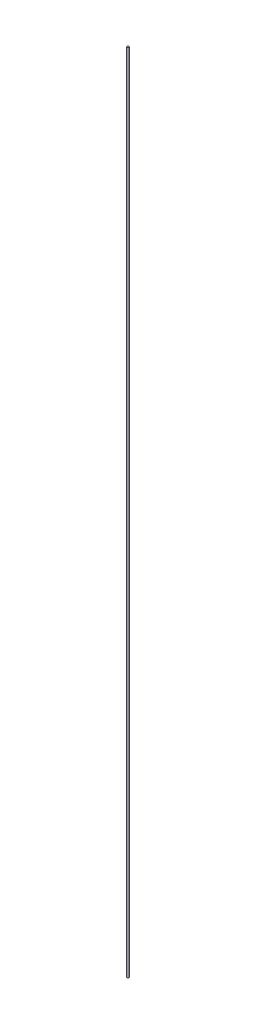
ISO-10303-21;
HEADER;
FILE_DESCRIPTION(('STEP AP214'),'2;1');
FILE_NAME('part.step','',(''),(''),'','','');
FILE_SCHEMA(('AUTOMOTIVE_DESIGN { 1 0 10303 214 1 1 1 1 }'));
ENDSEC;
DATA;
#1=APPLICATION_CONTEXT('core data for automotive mechanical design processes');
#2=APPLICATION_PROTOCOL_DEFINITION('international standard','automotive_design',2000,#1);
#3=PRODUCT_CONTEXT('',#1,'mechanical');
#4=PRODUCT('Part','Part','',(#3));
#5=PRODUCT_RELATED_PRODUCT_CATEGORY('part','',(#4));
#6=PRODUCT_DEFINITION_FORMATION('','',#4);
#7=PRODUCT_DEFINITION_CONTEXT('part definition',#1,'design');
#8=PRODUCT_DEFINITION('design','',#6,#7);
#9=PRODUCT_DEFINITION_SHAPE('','',#8);
#10=(LENGTH_UNIT() NAMED_UNIT(*) SI_UNIT(.MILLI.,.METRE.));
#11=(NAMED_UNIT(*) PLANE_ANGLE_UNIT() SI_UNIT($,.RADIAN.));
#12=(NAMED_UNIT(*) SI_UNIT($,.STERADIAN.) SOLID_ANGLE_UNIT());
#13=UNCERTAINTY_MEASURE_WITH_UNIT(LENGTH_MEASURE(1.E-05),#10,'distance_accuracy_value','');
#14=(GEOMETRIC_REPRESENTATION_CONTEXT(3) GLOBAL_UNCERTAINTY_ASSIGNED_CONTEXT((#13)) GLOBAL_UNIT_ASSIGNED_CONTEXT((#10,
#11,#12)) REPRESENTATION_CONTEXT('',''));
#15=CARTESIAN_POINT('',(0.,0.,0.));
#16=DIRECTION('',(0.,0.,1.));
#17=DIRECTION('',(1.,0.,0.));
#18=AXIS2_PLACEMENT_3D('',#15,#16,#17);
#19=CARTESIAN_POINT('',(0.,2000.,0.));
#20=DIRECTION('',(0.,1.,0.));
#21=DIRECTION('',(0.,0.,1.));
#22=AXIS2_PLACEMENT_3D('',#19,#20,#21);
#23=PLANE('',#22);
#24=CARTESIAN_POINT('',(0.,2000.,0.));
#25=DIRECTION('',(0.,-1.,0.));
#26=DIRECTION('',(1.,0.,0.));
#27=AXIS2_PLACEMENT_3D('',#24,#25,#26);
#28=CIRCLE('',#27,2.6);
#29=CARTESIAN_POINT('',(2.6,2000.,0.));
#30=VERTEX_POINT('',#29);
#31=EDGE_CURVE('E9',#30,#30,#28,.T.);
#32=ORIENTED_EDGE('',*,*,#31,.F.);
#33=EDGE_LOOP('',(#32));
#34=FACE_BOUND('',#33,.T.);
#35=ADVANCED_FACE('F13',(#34),#23,.T.);
#36=CARTESIAN_POINT('',(0.,0.,0.));
#37=DIRECTION('',(0.,-1.,0.));
#38=DIRECTION('',(0.,0.,-1.));
#39=AXIS2_PLACEMENT_3D('',#36,#37,#38);
#40=PLANE('',#39);
#41=CARTESIAN_POINT('',(0.,0.,0.));
#42=DIRECTION('',(0.,1.,0.));
#43=DIRECTION('',(1.,0.,0.));
#44=AXIS2_PLACEMENT_3D('',#41,#42,#43);
#45=CIRCLE('',#44,2.6);
#46=CARTESIAN_POINT('',(2.6,0.,0.));
#47=VERTEX_POINT('',#46);
#48=EDGE_CURVE('E21',#47,#47,#45,.T.);
#49=ORIENTED_EDGE('',*,*,#48,.F.);
#50=EDGE_LOOP('',(#49));
#51=FACE_BOUND('',#50,.T.);
#52=ADVANCED_FACE('F35',(#51),#40,.T.);
#53=CARTESIAN_POINT('',(0.,0.,0.));
#54=DIRECTION('',(0.,1.,0.));
#55=DIRECTION('',(1.,0.,0.));
#56=AXIS2_PLACEMENT_3D('',#53,#54,#55);
#57=CYLINDRICAL_SURFACE('',#56,2.6);
#58=ORIENTED_EDGE('',*,*,#31,.T.);
#59=EDGE_LOOP('',(#58));
#60=FACE_BOUND('',#59,.T.);
#61=ORIENTED_EDGE('',*,*,#48,.T.);
#62=EDGE_LOOP('',(#61));
#63=FACE_BOUND('',#62,.T.);
#64=ADVANCED_FACE('F15',(#60,#63),#57,.T.);
#65=CLOSED_SHELL('',(#35,#52,#64));
#66=MANIFOLD_SOLID_BREP('B1',#65);
#67=ADVANCED_BREP_SHAPE_REPRESENTATION('',(#18,#66),#14);
#68=SHAPE_DEFINITION_REPRESENTATION(#9,#67);
ENDSEC;
END-ISO-10303-21;
